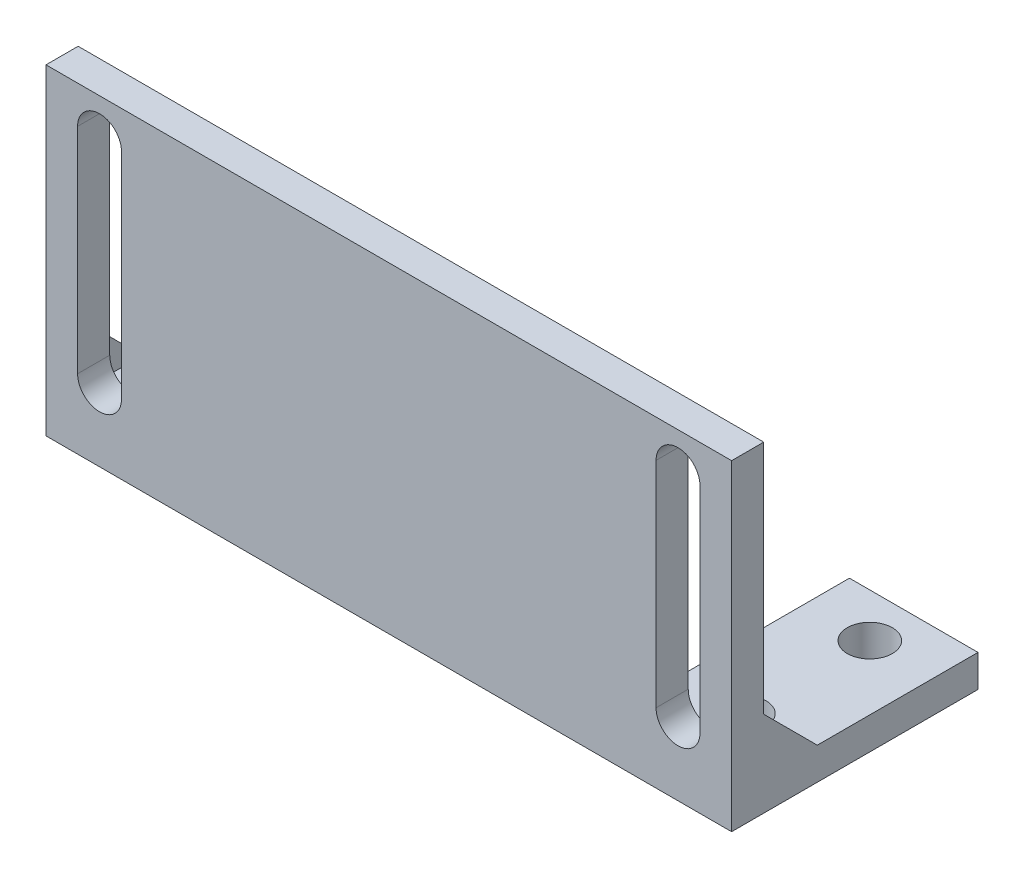
ISO-10303-21;
HEADER;
FILE_DESCRIPTION(('STEP AP214'),'2;1');
FILE_NAME('part.step','',(''),(''),'','','');
FILE_SCHEMA(('AUTOMOTIVE_DESIGN { 1 0 10303 214 1 1 1 1 }'));
ENDSEC;
DATA;
#1=APPLICATION_CONTEXT('core data for automotive mechanical design processes');
#2=APPLICATION_PROTOCOL_DEFINITION('international standard','automotive_design',2000,#1);
#3=PRODUCT_CONTEXT('',#1,'mechanical');
#4=PRODUCT('Part','Part','',(#3));
#5=PRODUCT_RELATED_PRODUCT_CATEGORY('part','',(#4));
#6=PRODUCT_DEFINITION_FORMATION('','',#4);
#7=PRODUCT_DEFINITION_CONTEXT('part definition',#1,'design');
#8=PRODUCT_DEFINITION('design','',#6,#7);
#9=PRODUCT_DEFINITION_SHAPE('','',#8);
#10=(LENGTH_UNIT() NAMED_UNIT(*) SI_UNIT(.MILLI.,.METRE.));
#11=(NAMED_UNIT(*) PLANE_ANGLE_UNIT() SI_UNIT($,.RADIAN.));
#12=(NAMED_UNIT(*) SI_UNIT($,.STERADIAN.) SOLID_ANGLE_UNIT());
#13=UNCERTAINTY_MEASURE_WITH_UNIT(LENGTH_MEASURE(1.E-05),#10,'distance_accuracy_value','');
#14=(GEOMETRIC_REPRESENTATION_CONTEXT(3) GLOBAL_UNCERTAINTY_ASSIGNED_CONTEXT((#13)) GLOBAL_UNIT_ASSIGNED_CONTEXT((#10,
#11,#12)) REPRESENTATION_CONTEXT('',''));
#15=CARTESIAN_POINT('',(0.,0.,0.));
#16=DIRECTION('',(0.,0.,1.));
#17=DIRECTION('',(1.,0.,0.));
#18=AXIS2_PLACEMENT_3D('',#15,#16,#17);
#19=CARTESIAN_POINT('',(0.,0.,0.));
#20=DIRECTION('',(0.,-1.,0.));
#21=DIRECTION('',(0.,0.,-1.));
#22=AXIS2_PLACEMENT_3D('',#19,#20,#21);
#23=PLANE('',#22);
#24=CARTESIAN_POINT('',(6.,0.,-18.9));
#25=DIRECTION('',(0.,-1.,0.));
#26=DIRECTION('',(0.,0.,-1.));
#27=AXIS2_PLACEMENT_3D('',#24,#25,#26);
#28=CIRCLE('',#27,2.1);
#29=CARTESIAN_POINT('',(6.,0.,-21.));
#30=VERTEX_POINT('',#29);
#31=EDGE_CURVE('E250',#30,#30,#28,.T.);
#32=ORIENTED_EDGE('',*,*,#31,.T.);
#33=EDGE_LOOP('',(#32));
#34=FACE_BOUND('',#33,.T.);
#35=CARTESIAN_POINT('',(6.00000000000001,0.,-7.1));
#36=DIRECTION('',(0.,-1.,0.));
#37=DIRECTION('',(0.,0.,-1.));
#38=AXIS2_PLACEMENT_3D('',#35,#36,#37);
#39=CIRCLE('',#38,2.1);
#40=CARTESIAN_POINT('',(6.00000000000001,0.,-9.2));
#41=VERTEX_POINT('',#40);
#42=EDGE_CURVE('E230',#41,#41,#39,.T.);
#43=ORIENTED_EDGE('',*,*,#42,.T.);
#44=EDGE_LOOP('',(#43));
#45=FACE_BOUND('',#44,.T.);
#46=DIRECTION('',(0.,0.,1.));
#47=VECTOR('',#46,1.);
#48=CARTESIAN_POINT('',(0.,0.,0.));
#49=LINE('',#48,#47);
#50=CARTESIAN_POINT('',(0.,0.,-23.));
#51=VERTEX_POINT('',#50);
#52=CARTESIAN_POINT('',(0.,0.,-7.99999999999994));
#53=VERTEX_POINT('',#52);
#54=EDGE_CURVE('E262',#51,#53,#49,.T.);
#55=ORIENTED_EDGE('',*,*,#54,.T.);
#56=DIRECTION('',(-1.,0.,0.));
#57=VECTOR('',#56,1.);
#58=CARTESIAN_POINT('',(0.,0.,-7.99999999999994));
#59=LINE('',#58,#57);
#60=CARTESIAN_POINT('',(1.,0.,-7.99999999999994));
#61=VERTEX_POINT('',#60);
#62=EDGE_CURVE('E196',#53,#61,#59,.F.);
#63=ORIENTED_EDGE('',*,*,#62,.T.);
#64=DIRECTION('',(0.,0.,1.));
#65=VECTOR('',#64,1.);
#66=CARTESIAN_POINT('',(1.,0.,0.));
#67=LINE('',#66,#65);
#68=CARTESIAN_POINT('',(1.,7.6588041464376E-13,-3.));
#69=VERTEX_POINT('',#68);
#70=EDGE_CURVE('E212',#61,#69,#67,.T.);
#71=ORIENTED_EDGE('',*,*,#70,.T.);
#72=DIRECTION('',(1.,0.,0.));
#73=VECTOR('',#72,1.);
#74=CARTESIAN_POINT('',(0.,0.,-3.));
#75=LINE('',#74,#73);
#76=CARTESIAN_POINT('',(12.,0.,-3.));
#77=VERTEX_POINT('',#76);
#78=EDGE_CURVE('E340',#69,#77,#75,.T.);
#79=ORIENTED_EDGE('',*,*,#78,.T.);
#80=DIRECTION('',(0.,0.,-1.));
#81=VECTOR('',#80,1.);
#82=CARTESIAN_POINT('',(12.,0.,-23.));
#83=LINE('',#82,#81);
#84=CARTESIAN_POINT('',(12.,0.,-23.));
#85=VERTEX_POINT('',#84);
#86=EDGE_CURVE('E299',#77,#85,#83,.T.);
#87=ORIENTED_EDGE('',*,*,#86,.T.);
#88=DIRECTION('',(-1.,0.,0.));
#89=VECTOR('',#88,1.);
#90=CARTESIAN_POINT('',(0.,0.,-23.));
#91=LINE('',#90,#89);
#92=EDGE_CURVE('E303',#85,#51,#91,.T.);
#93=ORIENTED_EDGE('',*,*,#92,.T.);
#94=EDGE_LOOP('',(#55,#63,#71,#79,#87,#93));
#95=FACE_BOUND('',#94,.T.);
#96=ADVANCED_FACE('F41',(#34,#45,#95),#23,.F.);
#97=CARTESIAN_POINT('',(64.,-3.,0.));
#98=DIRECTION('',(0.,0.,1.));
#99=DIRECTION('',(1.,0.,0.));
#100=AXIS2_PLACEMENT_3D('',#97,#98,#99);
#101=PLANE('',#100);
#102=DIRECTION('',(1.,0.,0.));
#103=VECTOR('',#102,1.);
#104=CARTESIAN_POINT('',(0.,27.,0.));
#105=LINE('',#104,#103);
#106=CARTESIAN_POINT('',(0.,27.,0.));
#107=VERTEX_POINT('',#106);
#108=CARTESIAN_POINT('',(64.,27.,0.));
#109=VERTEX_POINT('',#108);
#110=EDGE_CURVE('E364',#107,#109,#105,.T.);
#111=ORIENTED_EDGE('',*,*,#110,.F.);
#112=DIRECTION('',(0.,1.,0.));
#113=VECTOR('',#112,1.);
#114=CARTESIAN_POINT('',(0.,-3.,0.));
#115=LINE('',#114,#113);
#116=CARTESIAN_POINT('',(0.,-3.,0.));
#117=VERTEX_POINT('',#116);
#118=EDGE_CURVE('E309',#117,#107,#115,.T.);
#119=ORIENTED_EDGE('',*,*,#118,.F.);
#120=DIRECTION('',(1.,0.,0.));
#121=VECTOR('',#120,1.);
#122=CARTESIAN_POINT('',(64.,-3.,0.));
#123=LINE('',#122,#121);
#124=CARTESIAN_POINT('',(64.,-3.,0.));
#125=VERTEX_POINT('',#124);
#126=EDGE_CURVE('E258',#117,#125,#123,.T.);
#127=ORIENTED_EDGE('',*,*,#126,.T.);
#128=DIRECTION('',(0.,1.,0.));
#129=VECTOR('',#128,1.);
#130=CARTESIAN_POINT('',(64.,-3.,0.));
#131=LINE('',#130,#129);
#132=EDGE_CURVE('E288',#125,#109,#131,.T.);
#133=ORIENTED_EDGE('',*,*,#132,.T.);
#134=EDGE_LOOP('',(#111,#119,#127,#133));
#135=FACE_BOUND('',#134,.T.);
#136=CARTESIAN_POINT('',(59.,23.5,0.));
#137=DIRECTION('',(0.,0.,1.));
#138=DIRECTION('',(1.,0.,0.));
#139=AXIS2_PLACEMENT_3D('',#136,#137,#138);
#140=CIRCLE('',#139,2.05);
#141=CARTESIAN_POINT('',(61.05,23.5,0.));
#142=VERTEX_POINT('',#141);
#143=CARTESIAN_POINT('',(56.95,23.5,0.));
#144=VERTEX_POINT('',#143);
#145=EDGE_CURVE('E345',#142,#144,#140,.T.);
#146=ORIENTED_EDGE('',*,*,#145,.F.);
#147=DIRECTION('',(0.,1.,0.));
#148=VECTOR('',#147,1.);
#149=CARTESIAN_POINT('',(61.05,-3.,0.));
#150=LINE('',#149,#148);
#151=CARTESIAN_POINT('',(61.05,3.5,0.));
#152=VERTEX_POINT('',#151);
#153=EDGE_CURVE('E462',#152,#142,#150,.T.);
#154=ORIENTED_EDGE('',*,*,#153,.F.);
#155=CARTESIAN_POINT('',(59.,3.5,0.));
#156=DIRECTION('',(0.,0.,1.));
#157=DIRECTION('',(1.,0.,0.));
#158=AXIS2_PLACEMENT_3D('',#155,#156,#157);
#159=CIRCLE('',#158,2.05000000000001);
#160=CARTESIAN_POINT('',(56.95,3.5,0.));
#161=VERTEX_POINT('',#160);
#162=EDGE_CURVE('E358',#161,#152,#159,.T.);
#163=ORIENTED_EDGE('',*,*,#162,.F.);
#164=DIRECTION('',(0.,-1.,0.));
#165=VECTOR('',#164,1.);
#166=CARTESIAN_POINT('',(56.95,-3.,0.));
#167=LINE('',#166,#165);
#168=EDGE_CURVE('E351',#144,#161,#167,.T.);
#169=ORIENTED_EDGE('',*,*,#168,.F.);
#170=EDGE_LOOP('',(#146,#154,#163,#169));
#171=FACE_BOUND('',#170,.T.);
#172=CARTESIAN_POINT('',(4.99999999999998,23.5000000000002,0.));
#173=DIRECTION('',(0.,0.,1.));
#174=DIRECTION('',(1.,0.,0.));
#175=AXIS2_PLACEMENT_3D('',#172,#173,#174);
#176=CIRCLE('',#175,2.05);
#177=CARTESIAN_POINT('',(7.04999999999998,23.5000000000002,0.));
#178=VERTEX_POINT('',#177);
#179=CARTESIAN_POINT('',(2.94999999999997,23.5000000000002,0.));
#180=VERTEX_POINT('',#179);
#181=EDGE_CURVE('E459',#178,#180,#176,.T.);
#182=ORIENTED_EDGE('',*,*,#181,.F.);
#183=DIRECTION('',(0.,1.,0.));
#184=VECTOR('',#183,1.);
#185=CARTESIAN_POINT('',(7.04999999999979,-2.9999999999996,0.));
#186=LINE('',#185,#184);
#187=CARTESIAN_POINT('',(7.04999999999984,3.50000000000022,0.));
#188=VERTEX_POINT('',#187);
#189=EDGE_CURVE('E414',#188,#178,#186,.T.);
#190=ORIENTED_EDGE('',*,*,#189,.F.);
#191=CARTESIAN_POINT('',(4.99999999999984,3.50000000000022,0.));
#192=DIRECTION('',(0.,0.,1.));
#193=DIRECTION('',(1.,0.,0.));
#194=AXIS2_PLACEMENT_3D('',#191,#192,#193);
#195=CIRCLE('',#194,2.05);
#196=CARTESIAN_POINT('',(2.94999999999985,3.50000000000022,0.));
#197=VERTEX_POINT('',#196);
#198=EDGE_CURVE('E452',#197,#188,#195,.T.);
#199=ORIENTED_EDGE('',*,*,#198,.F.);
#200=DIRECTION('',(0.,-1.,0.));
#201=VECTOR('',#200,1.);
#202=CARTESIAN_POINT('',(2.9499999999998,-2.9999999999996,0.));
#203=LINE('',#202,#201);
#204=EDGE_CURVE('E456',#180,#197,#203,.T.);
#205=ORIENTED_EDGE('',*,*,#204,.F.);
#206=EDGE_LOOP('',(#182,#190,#199,#205));
#207=FACE_BOUND('',#206,.T.);
#208=ADVANCED_FACE('F43',(#135,#171,#207),#101,.T.);
#209=CARTESIAN_POINT('',(0.,-3.,0.));
#210=DIRECTION('',(-1.,0.,0.));
#211=DIRECTION('',(0.,0.,1.));
#212=AXIS2_PLACEMENT_3D('',#209,#210,#211);
#213=PLANE('',#212);
#214=DIRECTION('',(0.,0.,1.));
#215=VECTOR('',#214,1.);
#216=CARTESIAN_POINT('',(0.,-3.,0.));
#217=LINE('',#216,#215);
#218=CARTESIAN_POINT('',(0.,-3.,-23.));
#219=VERTEX_POINT('',#218);
#220=EDGE_CURVE('E285',#219,#117,#217,.T.);
#221=ORIENTED_EDGE('',*,*,#220,.T.);
#222=ORIENTED_EDGE('',*,*,#118,.T.);
#223=DIRECTION('',(0.,0.,1.));
#224=VECTOR('',#223,1.);
#225=CARTESIAN_POINT('',(0.,27.,0.));
#226=LINE('',#225,#224);
#227=CARTESIAN_POINT('',(0.,27.,-3.));
#228=VERTEX_POINT('',#227);
#229=EDGE_CURVE('E216',#228,#107,#226,.T.);
#230=ORIENTED_EDGE('',*,*,#229,.F.);
#231=DIRECTION('',(0.,-1.,0.));
#232=VECTOR('',#231,1.);
#233=CARTESIAN_POINT('',(0.,27.,-3.));
#234=LINE('',#233,#232);
#235=CARTESIAN_POINT('',(0.,4.99999999999994,-3.));
#236=VERTEX_POINT('',#235);
#237=EDGE_CURVE('E207',#228,#236,#234,.T.);
#238=ORIENTED_EDGE('',*,*,#237,.T.);
#239=DIRECTION('',(0.,-0.707106781186547,-0.707106781186548));
#240=VECTOR('',#239,1.);
#241=CARTESIAN_POINT('',(0.,4.99999999999994,-3.));
#242=LINE('',#241,#240);
#243=EDGE_CURVE('E189',#236,#53,#242,.T.);
#244=ORIENTED_EDGE('',*,*,#243,.T.);
#245=ORIENTED_EDGE('',*,*,#54,.F.);
#246=DIRECTION('',(0.,1.,0.));
#247=VECTOR('',#246,1.);
#248=CARTESIAN_POINT('',(0.,-3.,-23.));
#249=LINE('',#248,#247);
#250=EDGE_CURVE('E313',#219,#51,#249,.T.);
#251=ORIENTED_EDGE('',*,*,#250,.F.);
#252=EDGE_LOOP('',(#221,#222,#230,#238,#244,#245,#251));
#253=FACE_BOUND('',#252,.T.);
#254=ADVANCED_FACE('F214',(#253),#213,.T.);
#255=CARTESIAN_POINT('',(0.,-3.,-23.));
#256=DIRECTION('',(0.,0.,-1.));
#257=DIRECTION('',(-1.,0.,0.));
#258=AXIS2_PLACEMENT_3D('',#255,#256,#257);
#259=PLANE('',#258);
#260=ORIENTED_EDGE('',*,*,#92,.F.);
#261=DIRECTION('',(0.,1.,0.));
#262=VECTOR('',#261,1.);
#263=CARTESIAN_POINT('',(12.,-3.,-23.));
#264=LINE('',#263,#262);
#265=CARTESIAN_POINT('',(12.,-3.,-23.));
#266=VERTEX_POINT('',#265);
#267=EDGE_CURVE('E316',#266,#85,#264,.T.);
#268=ORIENTED_EDGE('',*,*,#267,.F.);
#269=DIRECTION('',(-1.,0.,0.));
#270=VECTOR('',#269,1.);
#271=CARTESIAN_POINT('',(0.,-3.,-23.));
#272=LINE('',#271,#270);
#273=EDGE_CURVE('E281',#266,#219,#272,.T.);
#274=ORIENTED_EDGE('',*,*,#273,.T.);
#275=ORIENTED_EDGE('',*,*,#250,.T.);
#276=EDGE_LOOP('',(#260,#268,#274,#275));
#277=FACE_BOUND('',#276,.T.);
#278=ADVANCED_FACE('F545',(#277),#259,.T.);
#279=CARTESIAN_POINT('',(12.,-3.,-23.));
#280=DIRECTION('',(1.,0.,0.));
#281=DIRECTION('',(0.,0.,-1.));
#282=AXIS2_PLACEMENT_3D('',#279,#280,#281);
#283=PLANE('',#282);
#284=ORIENTED_EDGE('',*,*,#86,.F.);
#285=DIRECTION('',(0.,1.,0.));
#286=VECTOR('',#285,1.);
#287=CARTESIAN_POINT('',(12.,-3.,-3.));
#288=LINE('',#287,#286);
#289=CARTESIAN_POINT('',(12.,-3.,-3.));
#290=VERTEX_POINT('',#289);
#291=EDGE_CURVE('E319',#290,#77,#288,.T.);
#292=ORIENTED_EDGE('',*,*,#291,.F.);
#293=DIRECTION('',(0.,0.,-1.));
#294=VECTOR('',#293,1.);
#295=CARTESIAN_POINT('',(12.,-3.,-23.));
#296=LINE('',#295,#294);
#297=EDGE_CURVE('E277',#290,#266,#296,.T.);
#298=ORIENTED_EDGE('',*,*,#297,.T.);
#299=ORIENTED_EDGE('',*,*,#267,.T.);
#300=EDGE_LOOP('',(#284,#292,#298,#299));
#301=FACE_BOUND('',#300,.T.);
#302=ADVANCED_FACE('F540',(#301),#283,.T.);
#303=CARTESIAN_POINT('',(12.,-3.,-3.));
#304=DIRECTION('',(0.,0.,-1.));
#305=DIRECTION('',(-1.,0.,0.));
#306=AXIS2_PLACEMENT_3D('',#303,#304,#305);
#307=PLANE('',#306);
#308=DIRECTION('',(-1.,0.,0.));
#309=VECTOR('',#308,1.);
#310=CARTESIAN_POINT('',(12.,4.99999999999994,-3.));
#311=LINE('',#310,#309);
#312=CARTESIAN_POINT('',(1.,4.99999999999994,-3.));
#313=VERTEX_POINT('',#312);
#314=EDGE_CURVE('E193',#236,#313,#311,.F.);
#315=ORIENTED_EDGE('',*,*,#314,.F.);
#316=ORIENTED_EDGE('',*,*,#237,.F.);
#317=DIRECTION('',(1.,0.,0.));
#318=VECTOR('',#317,1.);
#319=CARTESIAN_POINT('',(0.,27.,-3.));
#320=LINE('',#319,#318);
#321=CARTESIAN_POINT('',(64.,27.,-3.));
#322=VERTEX_POINT('',#321);
#323=EDGE_CURVE('E344',#228,#322,#320,.T.);
#324=ORIENTED_EDGE('',*,*,#323,.T.);
#325=DIRECTION('',(0.,-1.,0.));
#326=VECTOR('',#325,1.);
#327=CARTESIAN_POINT('',(64.,27.,-3.));
#328=LINE('',#327,#326);
#329=CARTESIAN_POINT('',(64.,4.99999999999994,-3.));
#330=VERTEX_POINT('',#329);
#331=EDGE_CURVE('E62',#322,#330,#328,.T.);
#332=ORIENTED_EDGE('',*,*,#331,.T.);
#333=DIRECTION('',(-1.,0.,0.));
#334=VECTOR('',#333,1.);
#335=CARTESIAN_POINT('',(12.,4.99999999999993,-3.));
#336=LINE('',#335,#334);
#337=CARTESIAN_POINT('',(63.,4.99999999999994,-3.));
#338=VERTEX_POINT('',#337);
#339=EDGE_CURVE('E57',#338,#330,#336,.F.);
#340=ORIENTED_EDGE('',*,*,#339,.F.);
#341=DIRECTION('',(0.,-1.,0.));
#342=VECTOR('',#341,1.);
#343=CARTESIAN_POINT('',(63.,-3.,-3.));
#344=LINE('',#343,#342);
#345=CARTESIAN_POINT('',(63.,0.,-3.));
#346=VERTEX_POINT('',#345);
#347=EDGE_CURVE('E382',#338,#346,#344,.T.);
#348=ORIENTED_EDGE('',*,*,#347,.T.);
#349=CARTESIAN_POINT('',(52.,0.,-3.));
#350=VERTEX_POINT('',#349);
#351=EDGE_CURVE('E312',#350,#346,#75,.T.);
#352=ORIENTED_EDGE('',*,*,#351,.F.);
#353=DIRECTION('',(0.,1.,0.));
#354=VECTOR('',#353,1.);
#355=CARTESIAN_POINT('',(52.,-3.,-3.));
#356=LINE('',#355,#354);
#357=CARTESIAN_POINT('',(52.,-3.,-3.));
#358=VERTEX_POINT('',#357);
#359=EDGE_CURVE('E323',#358,#350,#356,.T.);
#360=ORIENTED_EDGE('',*,*,#359,.F.);
#361=DIRECTION('',(-1.,0.,0.));
#362=VECTOR('',#361,1.);
#363=CARTESIAN_POINT('',(12.,-3.,-3.));
#364=LINE('',#363,#362);
#365=EDGE_CURVE('E273',#358,#290,#364,.T.);
#366=ORIENTED_EDGE('',*,*,#365,.T.);
#367=ORIENTED_EDGE('',*,*,#291,.T.);
#368=ORIENTED_EDGE('',*,*,#78,.F.);
#369=DIRECTION('',(0.,-1.,0.));
#370=VECTOR('',#369,1.);
#371=CARTESIAN_POINT('',(1.,-3.,-3.));
#372=LINE('',#371,#370);
#373=EDGE_CURVE('E210',#313,#69,#372,.T.);
#374=ORIENTED_EDGE('',*,*,#373,.F.);
#375=EDGE_LOOP('',(#315,#316,#324,#332,#340,#348,#352,#360,#366,#367,#368,#374));
#376=FACE_BOUND('',#375,.T.);
#377=CARTESIAN_POINT('',(59.,23.5,-3.));
#378=DIRECTION('',(0.,0.,-1.));
#379=DIRECTION('',(-1.,0.,0.));
#380=AXIS2_PLACEMENT_3D('',#377,#378,#379);
#381=CIRCLE('',#380,2.05);
#382=CARTESIAN_POINT('',(56.95,23.5,-3.));
#383=VERTEX_POINT('',#382);
#384=CARTESIAN_POINT('',(61.05,23.5,-3.));
#385=VERTEX_POINT('',#384);
#386=EDGE_CURVE('E394',#383,#385,#381,.T.);
#387=ORIENTED_EDGE('',*,*,#386,.F.);
#388=DIRECTION('',(0.,1.,0.));
#389=VECTOR('',#388,1.);
#390=CARTESIAN_POINT('',(56.95,23.5,-3.));
#391=LINE('',#390,#389);
#392=CARTESIAN_POINT('',(56.95,3.5,-3.));
#393=VERTEX_POINT('',#392);
#394=EDGE_CURVE('E406',#393,#383,#391,.T.);
#395=ORIENTED_EDGE('',*,*,#394,.F.);
#396=CARTESIAN_POINT('',(59.,3.5,-3.));
#397=DIRECTION('',(0.,0.,-1.));
#398=DIRECTION('',(-1.,0.,0.));
#399=AXIS2_PLACEMENT_3D('',#396,#397,#398);
#400=CIRCLE('',#399,2.05000000000001);
#401=CARTESIAN_POINT('',(61.05,3.5,-3.));
#402=VERTEX_POINT('',#401);
#403=EDGE_CURVE('E402',#402,#393,#400,.T.);
#404=ORIENTED_EDGE('',*,*,#403,.F.);
#405=DIRECTION('',(0.,-1.,0.));
#406=VECTOR('',#405,1.);
#407=CARTESIAN_POINT('',(61.05,23.5,-3.));
#408=LINE('',#407,#406);
#409=EDGE_CURVE('E397',#385,#402,#408,.T.);
#410=ORIENTED_EDGE('',*,*,#409,.F.);
#411=EDGE_LOOP('',(#387,#395,#404,#410));
#412=FACE_BOUND('',#411,.T.);
#413=CARTESIAN_POINT('',(4.99999999999998,23.5000000000002,-3.));
#414=DIRECTION('',(0.,0.,-1.));
#415=DIRECTION('',(1.,0.,0.));
#416=AXIS2_PLACEMENT_3D('',#413,#414,#415);
#417=CIRCLE('',#416,2.05);
#418=CARTESIAN_POINT('',(2.94999999999997,23.5000000000002,-3.));
#419=VERTEX_POINT('',#418);
#420=CARTESIAN_POINT('',(7.04999999999998,23.5000000000002,-3.));
#421=VERTEX_POINT('',#420);
#422=EDGE_CURVE('E393',#419,#421,#417,.T.);
#423=ORIENTED_EDGE('',*,*,#422,.F.);
#424=DIRECTION('',(0.,1.,0.));
#425=VECTOR('',#424,1.);
#426=CARTESIAN_POINT('',(2.94999999999997,23.5000000000002,-3.));
#427=LINE('',#426,#425);
#428=CARTESIAN_POINT('',(2.94999999999985,3.50000000000022,-3.));
#429=VERTEX_POINT('',#428);
#430=EDGE_CURVE('E434',#429,#419,#427,.T.);
#431=ORIENTED_EDGE('',*,*,#430,.F.);
#432=CARTESIAN_POINT('',(4.99999999999984,3.50000000000022,-3.));
#433=DIRECTION('',(0.,0.,-1.));
#434=DIRECTION('',(1.,0.,0.));
#435=AXIS2_PLACEMENT_3D('',#432,#433,#434);
#436=CIRCLE('',#435,2.05);
#437=CARTESIAN_POINT('',(7.04999999999984,3.50000000000022,-3.));
#438=VERTEX_POINT('',#437);
#439=EDGE_CURVE('E430',#438,#429,#436,.T.);
#440=ORIENTED_EDGE('',*,*,#439,.F.);
#441=DIRECTION('',(0.,-1.,0.));
#442=VECTOR('',#441,1.);
#443=CARTESIAN_POINT('',(7.04999999999998,23.5000000000002,-3.));
#444=LINE('',#443,#442);
#445=EDGE_CURVE('E426',#421,#438,#444,.T.);
#446=ORIENTED_EDGE('',*,*,#445,.F.);
#447=EDGE_LOOP('',(#423,#431,#440,#446));
#448=FACE_BOUND('',#447,.T.);
#449=ADVANCED_FACE('F205',(#376,#412,#448),#307,.T.);
#450=CARTESIAN_POINT('',(52.,-3.,-3.));
#451=DIRECTION('',(-1.,0.,0.));
#452=DIRECTION('',(0.,0.,1.));
#453=AXIS2_PLACEMENT_3D('',#450,#451,#452);
#454=PLANE('',#453);
#455=DIRECTION('',(0.,0.,1.));
#456=VECTOR('',#455,1.);
#457=CARTESIAN_POINT('',(52.,0.,-3.));
#458=LINE('',#457,#456);
#459=CARTESIAN_POINT('',(52.,0.,-23.));
#460=VERTEX_POINT('',#459);
#461=EDGE_CURVE('E295',#460,#350,#458,.T.);
#462=ORIENTED_EDGE('',*,*,#461,.F.);
#463=DIRECTION('',(0.,1.,0.));
#464=VECTOR('',#463,1.);
#465=CARTESIAN_POINT('',(52.,-3.,-23.));
#466=LINE('',#465,#464);
#467=CARTESIAN_POINT('',(52.,-3.,-23.));
#468=VERTEX_POINT('',#467);
#469=EDGE_CURVE('E327',#468,#460,#466,.T.);
#470=ORIENTED_EDGE('',*,*,#469,.F.);
#471=DIRECTION('',(0.,0.,1.));
#472=VECTOR('',#471,1.);
#473=CARTESIAN_POINT('',(52.,-3.,-3.));
#474=LINE('',#473,#472);
#475=EDGE_CURVE('E269',#468,#358,#474,.T.);
#476=ORIENTED_EDGE('',*,*,#475,.T.);
#477=ORIENTED_EDGE('',*,*,#359,.T.);
#478=EDGE_LOOP('',(#462,#470,#476,#477));
#479=FACE_BOUND('',#478,.T.);
#480=ADVANCED_FACE('F526',(#479),#454,.T.);
#481=CARTESIAN_POINT('',(52.,-3.,-23.));
#482=DIRECTION('',(0.,0.,-1.));
#483=DIRECTION('',(-1.,0.,0.));
#484=AXIS2_PLACEMENT_3D('',#481,#482,#483);
#485=PLANE('',#484);
#486=DIRECTION('',(-1.,0.,0.));
#487=VECTOR('',#486,1.);
#488=CARTESIAN_POINT('',(52.,0.,-23.));
#489=LINE('',#488,#487);
#490=CARTESIAN_POINT('',(64.,0.,-23.));
#491=VERTEX_POINT('',#490);
#492=EDGE_CURVE('E291',#491,#460,#489,.T.);
#493=ORIENTED_EDGE('',*,*,#492,.F.);
#494=DIRECTION('',(0.,1.,0.));
#495=VECTOR('',#494,1.);
#496=CARTESIAN_POINT('',(64.,-3.,-23.));
#497=LINE('',#496,#495);
#498=CARTESIAN_POINT('',(64.,-3.,-23.));
#499=VERTEX_POINT('',#498);
#500=EDGE_CURVE('E330',#499,#491,#497,.T.);
#501=ORIENTED_EDGE('',*,*,#500,.F.);
#502=DIRECTION('',(-1.,0.,0.));
#503=VECTOR('',#502,1.);
#504=CARTESIAN_POINT('',(52.,-3.,-23.));
#505=LINE('',#504,#503);
#506=EDGE_CURVE('E265',#499,#468,#505,.T.);
#507=ORIENTED_EDGE('',*,*,#506,.T.);
#508=ORIENTED_EDGE('',*,*,#469,.T.);
#509=EDGE_LOOP('',(#493,#501,#507,#508));
#510=FACE_BOUND('',#509,.T.);
#511=ADVANCED_FACE('F531',(#510),#485,.T.);
#512=CARTESIAN_POINT('',(64.,-3.,-23.));
#513=DIRECTION('',(1.,0.,0.));
#514=DIRECTION('',(0.,0.,-1.));
#515=AXIS2_PLACEMENT_3D('',#512,#513,#514);
#516=PLANE('',#515);
#517=DIRECTION('',(0.,-0.707106781186547,-0.707106781186548));
#518=VECTOR('',#517,1.);
#519=CARTESIAN_POINT('',(64.,5.,-2.99999999999994));
#520=LINE('',#519,#518);
#521=CARTESIAN_POINT('',(64.,0.,-7.99999999999994));
#522=VERTEX_POINT('',#521);
#523=EDGE_CURVE('E378',#330,#522,#520,.T.);
#524=ORIENTED_EDGE('',*,*,#523,.F.);
#525=ORIENTED_EDGE('',*,*,#331,.F.);
#526=DIRECTION('',(0.,0.,-1.));
#527=VECTOR('',#526,1.);
#528=CARTESIAN_POINT('',(64.,27.,0.));
#529=LINE('',#528,#527);
#530=EDGE_CURVE('E226',#109,#322,#529,.T.);
#531=ORIENTED_EDGE('',*,*,#530,.F.);
#532=ORIENTED_EDGE('',*,*,#132,.F.);
#533=DIRECTION('',(0.,0.,-1.));
#534=VECTOR('',#533,1.);
#535=CARTESIAN_POINT('',(64.,-3.,-23.));
#536=LINE('',#535,#534);
#537=EDGE_CURVE('E261',#125,#499,#536,.T.);
#538=ORIENTED_EDGE('',*,*,#537,.T.);
#539=ORIENTED_EDGE('',*,*,#500,.T.);
#540=DIRECTION('',(0.,0.,-1.));
#541=VECTOR('',#540,1.);
#542=CARTESIAN_POINT('',(64.,0.,-23.));
#543=LINE('',#542,#541);
#544=EDGE_CURVE('E254',#522,#491,#543,.T.);
#545=ORIENTED_EDGE('',*,*,#544,.F.);
#546=EDGE_LOOP('',(#524,#525,#531,#532,#538,#539,#545));
#547=FACE_BOUND('',#546,.T.);
#548=ADVANCED_FACE('F375',(#547),#516,.T.);
#549=CARTESIAN_POINT('',(0.,-3.,0.));
#550=DIRECTION('',(0.,-1.,0.));
#551=DIRECTION('',(0.,0.,-1.));
#552=AXIS2_PLACEMENT_3D('',#549,#550,#551);
#553=PLANE('',#552);
#554=ORIENTED_EDGE('',*,*,#126,.F.);
#555=ORIENTED_EDGE('',*,*,#220,.F.);
#556=ORIENTED_EDGE('',*,*,#273,.F.);
#557=ORIENTED_EDGE('',*,*,#297,.F.);
#558=ORIENTED_EDGE('',*,*,#365,.F.);
#559=ORIENTED_EDGE('',*,*,#475,.F.);
#560=ORIENTED_EDGE('',*,*,#506,.F.);
#561=ORIENTED_EDGE('',*,*,#537,.F.);
#562=EDGE_LOOP('',(#554,#555,#556,#557,#558,#559,#560,#561));
#563=FACE_BOUND('',#562,.T.);
#564=CARTESIAN_POINT('',(58.,-3.,-18.9));
#565=DIRECTION('',(0.,-1.,0.));
#566=DIRECTION('',(0.,0.,1.));
#567=AXIS2_PLACEMENT_3D('',#564,#565,#566);
#568=CIRCLE('',#567,2.1);
#569=CARTESIAN_POINT('',(58.,-3.,-16.8));
#570=VERTEX_POINT('',#569);
#571=EDGE_CURVE('E219',#570,#570,#568,.T.);
#572=ORIENTED_EDGE('',*,*,#571,.F.);
#573=EDGE_LOOP('',(#572));
#574=FACE_BOUND('',#573,.T.);
#575=CARTESIAN_POINT('',(58.,-3.,-7.1));
#576=DIRECTION('',(0.,-1.,0.));
#577=DIRECTION('',(0.,0.,1.));
#578=AXIS2_PLACEMENT_3D('',#575,#576,#577);
#579=CIRCLE('',#578,2.1);
#580=CARTESIAN_POINT('',(58.,-3.,-4.99999999999999));
#581=VERTEX_POINT('',#580);
#582=EDGE_CURVE('E243',#581,#581,#579,.T.);
#583=ORIENTED_EDGE('',*,*,#582,.F.);
#584=EDGE_LOOP('',(#583));
#585=FACE_BOUND('',#584,.T.);
#586=CARTESIAN_POINT('',(6.00000000000001,-3.,-7.1));
#587=DIRECTION('',(0.,-1.,0.));
#588=DIRECTION('',(0.,0.,-1.));
#589=AXIS2_PLACEMENT_3D('',#586,#587,#588);
#590=CIRCLE('',#589,2.1);
#591=CARTESIAN_POINT('',(6.00000000000001,-3.,-9.2));
#592=VERTEX_POINT('',#591);
#593=EDGE_CURVE('E235',#592,#592,#590,.T.);
#594=ORIENTED_EDGE('',*,*,#593,.F.);
#595=EDGE_LOOP('',(#594));
#596=FACE_BOUND('',#595,.T.);
#597=CARTESIAN_POINT('',(6.,-3.,-18.9));
#598=DIRECTION('',(0.,-1.,0.));
#599=DIRECTION('',(0.,0.,-1.));
#600=AXIS2_PLACEMENT_3D('',#597,#598,#599);
#601=CIRCLE('',#600,2.1);
#602=CARTESIAN_POINT('',(6.,-3.,-21.));
#603=VERTEX_POINT('',#602);
#604=EDGE_CURVE('E234',#603,#603,#601,.T.);
#605=ORIENTED_EDGE('',*,*,#604,.F.);
#606=EDGE_LOOP('',(#605));
#607=FACE_BOUND('',#606,.T.);
#608=ADVANCED_FACE('F507',(#563,#574,#585,#596,#607),#553,.T.);
#609=CARTESIAN_POINT('',(58.,0.,-18.9));
#610=DIRECTION('',(0.,-1.,0.));
#611=DIRECTION('',(0.,0.,1.));
#612=AXIS2_PLACEMENT_3D('',#609,#610,#611);
#613=CIRCLE('',#612,2.1);
#614=CARTESIAN_POINT('',(58.,0.,-16.8));
#615=VERTEX_POINT('',#614);
#616=EDGE_CURVE('E224',#615,#615,#613,.T.);
#617=ORIENTED_EDGE('',*,*,#616,.T.);
#618=EDGE_LOOP('',(#617));
#619=FACE_BOUND('',#618,.T.);
#620=CARTESIAN_POINT('',(58.,0.,-7.1));
#621=DIRECTION('',(0.,-1.,0.));
#622=DIRECTION('',(0.,0.,1.));
#623=AXIS2_PLACEMENT_3D('',#620,#621,#622);
#624=CIRCLE('',#623,2.1);
#625=CARTESIAN_POINT('',(58.,0.,-4.99999999999999));
#626=VERTEX_POINT('',#625);
#627=EDGE_CURVE('E239',#626,#626,#624,.T.);
#628=ORIENTED_EDGE('',*,*,#627,.T.);
#629=EDGE_LOOP('',(#628));
#630=FACE_BOUND('',#629,.T.);
#631=DIRECTION('',(0.,0.,1.));
#632=VECTOR('',#631,1.);
#633=CARTESIAN_POINT('',(63.,0.,0.));
#634=LINE('',#633,#632);
#635=CARTESIAN_POINT('',(63.,0.,-7.99999999999994));
#636=VERTEX_POINT('',#635);
#637=EDGE_CURVE('E50',#636,#346,#634,.T.);
#638=ORIENTED_EDGE('',*,*,#637,.F.);
#639=DIRECTION('',(-1.,0.,0.));
#640=VECTOR('',#639,1.);
#641=CARTESIAN_POINT('',(0.,0.,-7.99999999999992));
#642=LINE('',#641,#640);
#643=EDGE_CURVE('E11',#636,#522,#642,.F.);
#644=ORIENTED_EDGE('',*,*,#643,.T.);
#645=ORIENTED_EDGE('',*,*,#544,.T.);
#646=ORIENTED_EDGE('',*,*,#492,.T.);
#647=ORIENTED_EDGE('',*,*,#461,.T.);
#648=ORIENTED_EDGE('',*,*,#351,.T.);
#649=EDGE_LOOP('',(#638,#644,#645,#646,#647,#648));
#650=FACE_BOUND('',#649,.T.);
#651=ADVANCED_FACE('F497',(#619,#630,#650),#23,.F.);
#652=CARTESIAN_POINT('',(6.,0.,-18.9));
#653=DIRECTION('',(0.,-1.,0.));
#654=DIRECTION('',(0.,0.,-1.));
#655=AXIS2_PLACEMENT_3D('',#652,#653,#654);
#656=CYLINDRICAL_SURFACE('',#655,2.1);
#657=ORIENTED_EDGE('',*,*,#31,.F.);
#658=EDGE_LOOP('',(#657));
#659=FACE_BOUND('',#658,.T.);
#660=ORIENTED_EDGE('',*,*,#604,.T.);
#661=EDGE_LOOP('',(#660));
#662=FACE_BOUND('',#661,.T.);
#663=ADVANCED_FACE('F506',(#659,#662),#656,.F.);
#664=CARTESIAN_POINT('',(6.00000000000001,0.,-7.1));
#665=DIRECTION('',(0.,-1.,0.));
#666=DIRECTION('',(0.,0.,-1.));
#667=AXIS2_PLACEMENT_3D('',#664,#665,#666);
#668=CYLINDRICAL_SURFACE('',#667,2.1);
#669=ORIENTED_EDGE('',*,*,#42,.F.);
#670=EDGE_LOOP('',(#669));
#671=FACE_BOUND('',#670,.T.);
#672=ORIENTED_EDGE('',*,*,#593,.T.);
#673=EDGE_LOOP('',(#672));
#674=FACE_BOUND('',#673,.T.);
#675=ADVANCED_FACE('F513',(#671,#674),#668,.F.);
#676=CARTESIAN_POINT('',(58.,0.,-7.1));
#677=DIRECTION('',(0.,-1.,0.));
#678=DIRECTION('',(0.,0.,-1.));
#679=AXIS2_PLACEMENT_3D('',#676,#677,#678);
#680=CYLINDRICAL_SURFACE('',#679,2.1);
#681=ORIENTED_EDGE('',*,*,#627,.F.);
#682=EDGE_LOOP('',(#681));
#683=FACE_BOUND('',#682,.T.);
#684=ORIENTED_EDGE('',*,*,#582,.T.);
#685=EDGE_LOOP('',(#684));
#686=FACE_BOUND('',#685,.T.);
#687=ADVANCED_FACE('F627',(#683,#686),#680,.F.);
#688=CARTESIAN_POINT('',(58.,0.,-18.9));
#689=DIRECTION('',(0.,-1.,0.));
#690=DIRECTION('',(0.,0.,-1.));
#691=AXIS2_PLACEMENT_3D('',#688,#689,#690);
#692=CYLINDRICAL_SURFACE('',#691,2.1);
#693=ORIENTED_EDGE('',*,*,#616,.F.);
#694=EDGE_LOOP('',(#693));
#695=FACE_BOUND('',#694,.T.);
#696=ORIENTED_EDGE('',*,*,#571,.T.);
#697=EDGE_LOOP('',(#696));
#698=FACE_BOUND('',#697,.T.);
#699=ADVANCED_FACE('F624',(#695,#698),#692,.F.);
#700=CARTESIAN_POINT('',(0.,27.,0.));
#701=DIRECTION('',(0.,1.,0.));
#702=DIRECTION('',(0.,0.,1.));
#703=AXIS2_PLACEMENT_3D('',#700,#701,#702);
#704=PLANE('',#703);
#705=ORIENTED_EDGE('',*,*,#323,.F.);
#706=ORIENTED_EDGE('',*,*,#229,.T.);
#707=ORIENTED_EDGE('',*,*,#110,.T.);
#708=ORIENTED_EDGE('',*,*,#530,.T.);
#709=EDGE_LOOP('',(#705,#706,#707,#708));
#710=FACE_BOUND('',#709,.T.);
#711=ADVANCED_FACE('F370',(#710),#704,.T.);
#712=CARTESIAN_POINT('',(4.99999999999998,23.5000000000002,24.));
#713=DIRECTION('',(0.,0.,-1.));
#714=DIRECTION('',(-1.,0.,0.));
#715=AXIS2_PLACEMENT_3D('',#712,#713,#714);
#716=CYLINDRICAL_SURFACE('',#715,2.05);
#717=ORIENTED_EDGE('',*,*,#181,.T.);
#718=DIRECTION('',(0.,0.,-1.));
#719=VECTOR('',#718,1.);
#720=CARTESIAN_POINT('',(2.94999999999997,23.5000000000002,24.));
#721=LINE('',#720,#719);
#722=EDGE_CURVE('E398',#180,#419,#721,.T.);
#723=ORIENTED_EDGE('',*,*,#722,.T.);
#724=ORIENTED_EDGE('',*,*,#422,.T.);
#725=DIRECTION('',(0.,0.,-1.));
#726=VECTOR('',#725,1.);
#727=CARTESIAN_POINT('',(7.04999999999998,23.5000000000002,24.));
#728=LINE('',#727,#726);
#729=EDGE_CURVE('E438',#178,#421,#728,.T.);
#730=ORIENTED_EDGE('',*,*,#729,.F.);
#731=EDGE_LOOP('',(#717,#723,#724,#730));
#732=FACE_BOUND('',#731,.T.);
#733=ADVANCED_FACE('F611',(#732),#716,.F.);
#734=CARTESIAN_POINT('',(2.94999999999997,23.5000000000002,24.));
#735=DIRECTION('',(-1.,0.,0.));
#736=DIRECTION('',(0.,-1.,0.));
#737=AXIS2_PLACEMENT_3D('',#734,#735,#736);
#738=PLANE('',#737);
#739=ORIENTED_EDGE('',*,*,#204,.T.);
#740=DIRECTION('',(0.,0.,-1.));
#741=VECTOR('',#740,1.);
#742=CARTESIAN_POINT('',(2.94999999999985,3.50000000000022,24.));
#743=LINE('',#742,#741);
#744=EDGE_CURVE('E441',#197,#429,#743,.T.);
#745=ORIENTED_EDGE('',*,*,#744,.T.);
#746=ORIENTED_EDGE('',*,*,#430,.T.);
#747=ORIENTED_EDGE('',*,*,#722,.F.);
#748=EDGE_LOOP('',(#739,#745,#746,#747));
#749=FACE_BOUND('',#748,.T.);
#750=ADVANCED_FACE('F607',(#749),#738,.F.);
#751=CARTESIAN_POINT('',(4.99999999999984,3.50000000000022,24.));
#752=DIRECTION('',(0.,0.,-1.));
#753=DIRECTION('',(-1.,0.,0.));
#754=AXIS2_PLACEMENT_3D('',#751,#752,#753);
#755=CYLINDRICAL_SURFACE('',#754,2.05);
#756=ORIENTED_EDGE('',*,*,#198,.T.);
#757=DIRECTION('',(0.,0.,-1.));
#758=VECTOR('',#757,1.);
#759=CARTESIAN_POINT('',(7.04999999999984,3.50000000000022,24.));
#760=LINE('',#759,#758);
#761=EDGE_CURVE('E444',#188,#438,#760,.T.);
#762=ORIENTED_EDGE('',*,*,#761,.T.);
#763=ORIENTED_EDGE('',*,*,#439,.T.);
#764=ORIENTED_EDGE('',*,*,#744,.F.);
#765=EDGE_LOOP('',(#756,#762,#763,#764));
#766=FACE_BOUND('',#765,.T.);
#767=ADVANCED_FACE('F610',(#766),#755,.F.);
#768=CARTESIAN_POINT('',(7.04999999999998,23.5000000000002,24.));
#769=DIRECTION('',(1.,0.,0.));
#770=DIRECTION('',(0.,1.,0.));
#771=AXIS2_PLACEMENT_3D('',#768,#769,#770);
#772=PLANE('',#771);
#773=ORIENTED_EDGE('',*,*,#189,.T.);
#774=ORIENTED_EDGE('',*,*,#729,.T.);
#775=ORIENTED_EDGE('',*,*,#445,.T.);
#776=ORIENTED_EDGE('',*,*,#761,.F.);
#777=EDGE_LOOP('',(#773,#774,#775,#776));
#778=FACE_BOUND('',#777,.T.);
#779=ADVANCED_FACE('F491',(#778),#772,.F.);
#780=CARTESIAN_POINT('',(59.,23.5,24.));
#781=DIRECTION('',(0.,0.,-1.));
#782=DIRECTION('',(-1.,0.,0.));
#783=AXIS2_PLACEMENT_3D('',#780,#781,#782);
#784=CYLINDRICAL_SURFACE('',#783,2.05);
#785=ORIENTED_EDGE('',*,*,#145,.T.);
#786=DIRECTION('',(0.,0.,-1.));
#787=VECTOR('',#786,1.);
#788=CARTESIAN_POINT('',(56.95,23.5,24.));
#789=LINE('',#788,#787);
#790=EDGE_CURVE('E411',#144,#383,#789,.T.);
#791=ORIENTED_EDGE('',*,*,#790,.T.);
#792=ORIENTED_EDGE('',*,*,#386,.T.);
#793=DIRECTION('',(0.,0.,-1.));
#794=VECTOR('',#793,1.);
#795=CARTESIAN_POINT('',(61.05,23.5,24.));
#796=LINE('',#795,#794);
#797=EDGE_CURVE('E410',#142,#385,#796,.T.);
#798=ORIENTED_EDGE('',*,*,#797,.F.);
#799=EDGE_LOOP('',(#785,#791,#792,#798));
#800=FACE_BOUND('',#799,.T.);
#801=ADVANCED_FACE('F477',(#800),#784,.F.);
#802=CARTESIAN_POINT('',(56.95,23.5,24.));
#803=DIRECTION('',(-1.,0.,0.));
#804=DIRECTION('',(0.,0.,1.));
#805=AXIS2_PLACEMENT_3D('',#802,#803,#804);
#806=PLANE('',#805);
#807=ORIENTED_EDGE('',*,*,#168,.T.);
#808=DIRECTION('',(0.,0.,-1.));
#809=VECTOR('',#808,1.);
#810=CARTESIAN_POINT('',(56.95,3.5,24.));
#811=LINE('',#810,#809);
#812=EDGE_CURVE('E415',#161,#393,#811,.T.);
#813=ORIENTED_EDGE('',*,*,#812,.T.);
#814=ORIENTED_EDGE('',*,*,#394,.T.);
#815=ORIENTED_EDGE('',*,*,#790,.F.);
#816=EDGE_LOOP('',(#807,#813,#814,#815));
#817=FACE_BOUND('',#816,.T.);
#818=ADVANCED_FACE('F483',(#817),#806,.F.);
#819=CARTESIAN_POINT('',(59.,3.5,24.));
#820=DIRECTION('',(0.,0.,-1.));
#821=DIRECTION('',(-1.,0.,0.));
#822=AXIS2_PLACEMENT_3D('',#819,#820,#821);
#823=CYLINDRICAL_SURFACE('',#822,2.05000000000001);
#824=ORIENTED_EDGE('',*,*,#162,.T.);
#825=DIRECTION('',(0.,0.,-1.));
#826=VECTOR('',#825,1.);
#827=CARTESIAN_POINT('',(61.05,3.5,24.));
#828=LINE('',#827,#826);
#829=EDGE_CURVE('E418',#152,#402,#828,.T.);
#830=ORIENTED_EDGE('',*,*,#829,.T.);
#831=ORIENTED_EDGE('',*,*,#403,.T.);
#832=ORIENTED_EDGE('',*,*,#812,.F.);
#833=EDGE_LOOP('',(#824,#830,#831,#832));
#834=FACE_BOUND('',#833,.T.);
#835=ADVANCED_FACE('F470',(#834),#823,.F.);
#836=CARTESIAN_POINT('',(61.05,23.5,24.));
#837=DIRECTION('',(1.,0.,0.));
#838=DIRECTION('',(0.,1.,0.));
#839=AXIS2_PLACEMENT_3D('',#836,#837,#838);
#840=PLANE('',#839);
#841=ORIENTED_EDGE('',*,*,#153,.T.);
#842=ORIENTED_EDGE('',*,*,#797,.T.);
#843=ORIENTED_EDGE('',*,*,#409,.T.);
#844=ORIENTED_EDGE('',*,*,#829,.F.);
#845=EDGE_LOOP('',(#841,#842,#843,#844));
#846=FACE_BOUND('',#845,.T.);
#847=ADVANCED_FACE('F475',(#846),#840,.F.);
#848=CARTESIAN_POINT('',(64.,5.,-2.99999999999994));
#849=DIRECTION('',(0.,-0.707106781186548,0.707106781186547));
#850=DIRECTION('',(0.,-0.707106781186547,-0.707106781186548));
#851=AXIS2_PLACEMENT_3D('',#848,#849,#850);
#852=PLANE('',#851);
#853=DIRECTION('',(0.,-0.707106781186547,-0.707106781186548));
#854=VECTOR('',#853,1.);
#855=CARTESIAN_POINT('',(63.,5.,-2.99999999999994));
#856=LINE('',#855,#854);
#857=EDGE_CURVE('E383',#338,#636,#856,.T.);
#858=ORIENTED_EDGE('',*,*,#857,.F.);
#859=ORIENTED_EDGE('',*,*,#339,.T.);
#860=ORIENTED_EDGE('',*,*,#523,.T.);
#861=ORIENTED_EDGE('',*,*,#643,.F.);
#862=EDGE_LOOP('',(#858,#859,#860,#861));
#863=FACE_BOUND('',#862,.T.);
#864=ADVANCED_FACE('F521',(#863),#852,.F.);
#865=CARTESIAN_POINT('',(63.,12.,-11.5));
#866=DIRECTION('',(1.,0.,0.));
#867=DIRECTION('',(0.,0.,-1.));
#868=AXIS2_PLACEMENT_3D('',#865,#866,#867);
#869=PLANE('',#868);
#870=ORIENTED_EDGE('',*,*,#347,.F.);
#871=ORIENTED_EDGE('',*,*,#857,.T.);
#872=ORIENTED_EDGE('',*,*,#637,.T.);
#873=EDGE_LOOP('',(#870,#871,#872));
#874=FACE_BOUND('',#873,.T.);
#875=ADVANCED_FACE('F522',(#874),#869,.F.);
#876=CARTESIAN_POINT('',(0.,4.99999999999994,-3.));
#877=DIRECTION('',(0.,-0.707106781186548,0.707106781186547));
#878=DIRECTION('',(0.,-0.707106781186547,-0.707106781186548));
#879=AXIS2_PLACEMENT_3D('',#876,#877,#878);
#880=PLANE('',#879);
#881=ORIENTED_EDGE('',*,*,#62,.F.);
#882=ORIENTED_EDGE('',*,*,#243,.F.);
#883=ORIENTED_EDGE('',*,*,#314,.T.);
#884=DIRECTION('',(0.,-0.707106781186547,-0.707106781186548));
#885=VECTOR('',#884,1.);
#886=CARTESIAN_POINT('',(1.,4.99999999999994,-3.));
#887=LINE('',#886,#885);
#888=EDGE_CURVE('E202',#313,#61,#887,.T.);
#889=ORIENTED_EDGE('',*,*,#888,.T.);
#890=EDGE_LOOP('',(#881,#882,#883,#889));
#891=FACE_BOUND('',#890,.T.);
#892=ADVANCED_FACE('F191',(#891),#880,.F.);
#893=CARTESIAN_POINT('',(1.,12.,-11.5));
#894=DIRECTION('',(1.,0.,0.));
#895=DIRECTION('',(0.,0.,-1.));
#896=AXIS2_PLACEMENT_3D('',#893,#894,#895);
#897=PLANE('',#896);
#898=ORIENTED_EDGE('',*,*,#373,.T.);
#899=ORIENTED_EDGE('',*,*,#70,.F.);
#900=ORIENTED_EDGE('',*,*,#888,.F.);
#901=EDGE_LOOP('',(#898,#899,#900));
#902=FACE_BOUND('',#901,.T.);
#903=ADVANCED_FACE('F584',(#902),#897,.T.);
#904=CLOSED_SHELL('',(#96,#208,#254,#278,#302,#449,#480,#511,#548,#608,#651,#663,#675,#687,#699,
#711,#733,#750,#767,#779,#801,#818,#835,#847,#864,#875,#892,#903));
#905=MANIFOLD_SOLID_BREP('B2',#904);
#906=ADVANCED_BREP_SHAPE_REPRESENTATION('',(#18,#905),#14);
#907=SHAPE_DEFINITION_REPRESENTATION(#9,#906);
ENDSEC;
END-ISO-10303-21;
